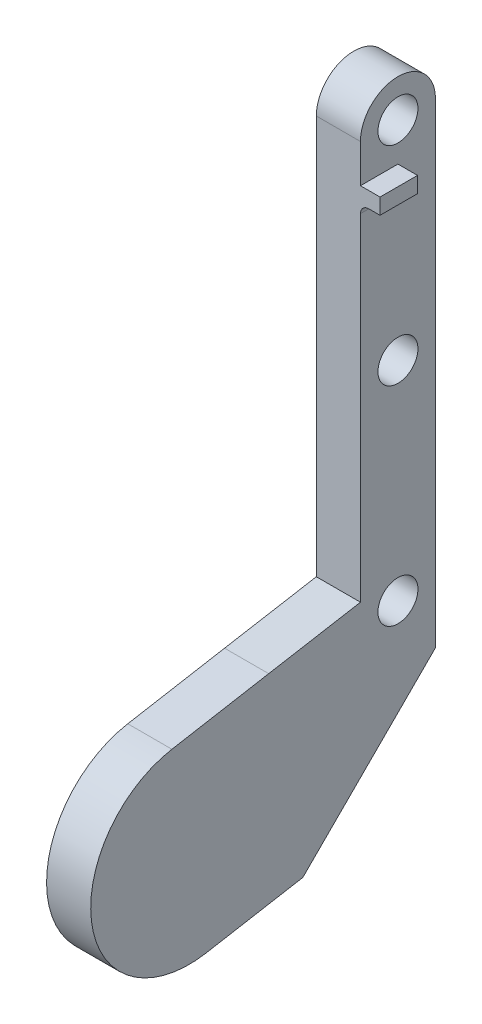
ISO-10303-21;
HEADER;
FILE_DESCRIPTION(('STEP AP214'),'2;1');
FILE_NAME('part.step','',(''),(''),'','','');
FILE_SCHEMA(('AUTOMOTIVE_DESIGN { 1 0 10303 214 1 1 1 1 }'));
ENDSEC;
DATA;
#1=APPLICATION_CONTEXT('core data for automotive mechanical design processes');
#2=APPLICATION_PROTOCOL_DEFINITION('international standard','automotive_design',2000,#1);
#3=PRODUCT_CONTEXT('',#1,'mechanical');
#4=PRODUCT('Part','Part','',(#3));
#5=PRODUCT_RELATED_PRODUCT_CATEGORY('part','',(#4));
#6=PRODUCT_DEFINITION_FORMATION('','',#4);
#7=PRODUCT_DEFINITION_CONTEXT('part definition',#1,'design');
#8=PRODUCT_DEFINITION('design','',#6,#7);
#9=PRODUCT_DEFINITION_SHAPE('','',#8);
#10=(LENGTH_UNIT() NAMED_UNIT(*) SI_UNIT(.MILLI.,.METRE.));
#11=(NAMED_UNIT(*) PLANE_ANGLE_UNIT() SI_UNIT($,.RADIAN.));
#12=(NAMED_UNIT(*) SI_UNIT($,.STERADIAN.) SOLID_ANGLE_UNIT());
#13=UNCERTAINTY_MEASURE_WITH_UNIT(LENGTH_MEASURE(1.E-05),#10,'distance_accuracy_value','');
#14=(GEOMETRIC_REPRESENTATION_CONTEXT(3) GLOBAL_UNCERTAINTY_ASSIGNED_CONTEXT((#13)) GLOBAL_UNIT_ASSIGNED_CONTEXT((#10,
#11,#12)) REPRESENTATION_CONTEXT('',''));
#15=CARTESIAN_POINT('',(0.,0.,0.));
#16=DIRECTION('',(0.,0.,1.));
#17=DIRECTION('',(1.,0.,0.));
#18=AXIS2_PLACEMENT_3D('',#15,#16,#17);
#19=CARTESIAN_POINT('',(2.65,0.,0.));
#20=DIRECTION('',(1.,0.,0.));
#21=DIRECTION('',(0.,0.,-1.));
#22=AXIS2_PLACEMENT_3D('',#19,#20,#21);
#23=PLANE('',#22);
#24=CARTESIAN_POINT('',(2.65,13.5,-25.0900000000005));
#25=DIRECTION('',(1.,0.,0.));
#26=DIRECTION('',(0.,0.,-1.));
#27=AXIS2_PLACEMENT_3D('',#24,#25,#26);
#28=CIRCLE('',#27,2.4);
#29=CARTESIAN_POINT('',(2.65,13.5,-27.4900000000005));
#30=VERTEX_POINT('',#29);
#31=EDGE_CURVE('E170',#30,#30,#28,.T.);
#32=ORIENTED_EDGE('',*,*,#31,.F.);
#33=EDGE_LOOP('',(#32));
#34=FACE_BOUND('',#33,.T.);
#35=CARTESIAN_POINT('',(2.65,38.5,-25.0900000000003));
#36=DIRECTION('',(1.,0.,0.));
#37=DIRECTION('',(0.,0.,-1.));
#38=AXIS2_PLACEMENT_3D('',#35,#36,#37);
#39=CIRCLE('',#38,2.4);
#40=CARTESIAN_POINT('',(2.65,38.5,-27.4900000000003));
#41=VERTEX_POINT('',#40);
#42=EDGE_CURVE('E173',#41,#41,#39,.T.);
#43=ORIENTED_EDGE('',*,*,#42,.F.);
#44=EDGE_LOOP('',(#43));
#45=FACE_BOUND('',#44,.T.);
#46=CARTESIAN_POINT('',(2.65,63.5,-25.09));
#47=DIRECTION('',(1.,0.,0.));
#48=DIRECTION('',(0.,0.,-1.));
#49=AXIS2_PLACEMENT_3D('',#46,#47,#48);
#50=CIRCLE('',#49,2.4);
#51=CARTESIAN_POINT('',(2.65,63.5,-27.49));
#52=VERTEX_POINT('',#51);
#53=EDGE_CURVE('E180',#52,#52,#50,.T.);
#54=ORIENTED_EDGE('',*,*,#53,.F.);
#55=EDGE_LOOP('',(#54));
#56=FACE_BOUND('',#55,.T.);
#57=DIRECTION('',(0.,1.,0.));
#58=VECTOR('',#57,1.);
#59=CARTESIAN_POINT('',(2.65,0.,-25.09));
#60=LINE('',#59,#58);
#61=CARTESIAN_POINT('',(2.65,56.,-25.09));
#62=VERTEX_POINT('',#61);
#63=CARTESIAN_POINT('',(2.65,58.9,-25.09));
#64=VERTEX_POINT('',#63);
#65=EDGE_CURVE('E148',#62,#64,#60,.T.);
#66=ORIENTED_EDGE('',*,*,#65,.F.);
#67=DIRECTION('',(0.,0.,1.));
#68=VECTOR('',#67,1.);
#69=CARTESIAN_POINT('',(2.65,56.,0.));
#70=LINE('',#69,#68);
#71=CARTESIAN_POINT('',(2.65,56.,-20.59));
#72=VERTEX_POINT('',#71);
#73=EDGE_CURVE('E151',#62,#72,#70,.T.);
#74=ORIENTED_EDGE('',*,*,#73,.T.);
#75=DIRECTION('',(0.,-1.,0.));
#76=VECTOR('',#75,1.);
#77=CARTESIAN_POINT('',(2.65,0.,-20.59));
#78=LINE('',#77,#76);
#79=CARTESIAN_POINT('',(2.65,15.5902971195293,-20.59));
#80=VERTEX_POINT('',#79);
#81=EDGE_CURVE('E249',#72,#80,#78,.T.);
#82=ORIENTED_EDGE('',*,*,#81,.T.);
#83=DIRECTION('',(0.,-0.171713304828408,0.985146964135254));
#84=VECTOR('',#83,1.);
#85=CARTESIAN_POINT('',(2.65,11.6475471569255,2.03019335010184));
#86=LINE('',#85,#84);
#87=CARTESIAN_POINT('',(2.65,13.6697799820138,-9.57168298907428));
#88=VERTEX_POINT('',#87);
#89=EDGE_CURVE('E245',#80,#88,#86,.T.);
#90=ORIENTED_EDGE('',*,*,#89,.T.);
#91=DIRECTION('',(0.,-0.173648177666931,0.984807753012208));
#92=VECTOR('',#91,1.);
#93=CARTESIAN_POINT('',(2.65,11.6207314855441,2.04904849646979));
#94=LINE('',#93,#92);
#95=CARTESIAN_POINT('',(2.65,11.6207314855441,2.04904849646979));
#96=VERTEX_POINT('',#95);
#97=EDGE_CURVE('E174',#88,#96,#94,.T.);
#98=ORIENTED_EDGE('',*,*,#97,.T.);
#99=CARTESIAN_POINT('',(2.65,0.,0.));
#100=DIRECTION('',(1.,0.,0.));
#101=DIRECTION('',(0.,0.,-1.));
#102=AXIS2_PLACEMENT_3D('',#99,#100,#101);
#103=CIRCLE('',#102,11.8);
#104=CARTESIAN_POINT('',(2.65,-11.6207314855441,-2.04904849646979));
#105=VERTEX_POINT('',#104);
#106=EDGE_CURVE('E187',#105,#96,#103,.F.);
#107=ORIENTED_EDGE('',*,*,#106,.F.);
#108=DIRECTION('',(0.,0.173648177666932,-0.984807753012208));
#109=VECTOR('',#108,1.);
#110=CARTESIAN_POINT('',(2.65,-11.6207314855441,-2.04904849646979));
#111=LINE('',#110,#109);
#112=CARTESIAN_POINT('',(2.65,-9.57168298907426,-13.6697799820139));
#113=VERTEX_POINT('',#112);
#114=EDGE_CURVE('E259',#105,#113,#111,.T.);
#115=ORIENTED_EDGE('',*,*,#114,.T.);
#116=DIRECTION('',(0.,-0.70710678118655,0.707106781186545));
#117=VECTOR('',#116,1.);
#118=CARTESIAN_POINT('',(2.65,-11.620731485544,-11.6207314855441));
#119=LINE('',#118,#117);
#120=CARTESIAN_POINT('',(2.65,6.34853702891123,-29.5899999999993));
#121=VERTEX_POINT('',#120);
#122=EDGE_CURVE('E256',#121,#113,#119,.T.);
#123=ORIENTED_EDGE('',*,*,#122,.F.);
#124=DIRECTION('',(0.,-1.,0.));
#125=VECTOR('',#124,1.);
#126=CARTESIAN_POINT('',(2.65,-3.91592493590791E-13,-29.5899999999992));
#127=LINE('',#126,#125);
#128=CARTESIAN_POINT('',(2.65,63.5,-29.59));
#129=VERTEX_POINT('',#128);
#130=EDGE_CURVE('E253',#129,#121,#127,.T.);
#131=ORIENTED_EDGE('',*,*,#130,.F.);
#132=CARTESIAN_POINT('',(2.65,63.5,-25.09));
#133=DIRECTION('',(1.,0.,0.));
#134=DIRECTION('',(0.,0.,-1.));
#135=AXIS2_PLACEMENT_3D('',#132,#133,#134);
#136=CIRCLE('',#135,4.5);
#137=CARTESIAN_POINT('',(2.65,63.5,-20.59));
#138=VERTEX_POINT('',#137);
#139=EDGE_CURVE('E250',#138,#129,#136,.F.);
#140=ORIENTED_EDGE('',*,*,#139,.F.);
#141=CARTESIAN_POINT('',(2.65,58.9,-20.59));
#142=VERTEX_POINT('',#141);
#143=EDGE_CURVE('E108',#138,#142,#78,.T.);
#144=ORIENTED_EDGE('',*,*,#143,.T.);
#145=DIRECTION('',(0.,0.,1.));
#146=VECTOR('',#145,1.);
#147=CARTESIAN_POINT('',(2.65,58.9,0.));
#148=LINE('',#147,#146);
#149=EDGE_CURVE('E74',#64,#142,#148,.T.);
#150=ORIENTED_EDGE('',*,*,#149,.F.);
#151=EDGE_LOOP('',(#66,#74,#82,#90,#98,#107,#115,#123,#131,#140,#144,#150));
#152=FACE_BOUND('',#151,.T.);
#153=ADVANCED_FACE('F70',(#34,#45,#56,#152),#23,.T.);
#154=CARTESIAN_POINT('',(2.65,63.5,-25.09));
#155=DIRECTION('',(-1.,0.,0.));
#156=DIRECTION('',(0.,0.,1.));
#157=AXIS2_PLACEMENT_3D('',#154,#155,#156);
#158=CYLINDRICAL_SURFACE('',#157,2.4);
#159=ORIENTED_EDGE('',*,*,#53,.T.);
#160=EDGE_LOOP('',(#159));
#161=FACE_BOUND('',#160,.T.);
#162=CARTESIAN_POINT('',(-2.65,63.5,-25.09));
#163=DIRECTION('',(1.,0.,0.));
#164=DIRECTION('',(0.,0.,-1.));
#165=AXIS2_PLACEMENT_3D('',#162,#163,#164);
#166=CIRCLE('',#165,2.4);
#167=CARTESIAN_POINT('',(-2.65,63.5,-27.49));
#168=VERTEX_POINT('',#167);
#169=EDGE_CURVE('E184',#168,#168,#166,.T.);
#170=ORIENTED_EDGE('',*,*,#169,.F.);
#171=EDGE_LOOP('',(#170));
#172=FACE_BOUND('',#171,.T.);
#173=ADVANCED_FACE('F334',(#161,#172),#158,.F.);
#174=CARTESIAN_POINT('',(2.65,38.5,-25.0900000000003));
#175=DIRECTION('',(-1.,0.,0.));
#176=DIRECTION('',(0.,0.,1.));
#177=AXIS2_PLACEMENT_3D('',#174,#175,#176);
#178=CYLINDRICAL_SURFACE('',#177,2.4);
#179=ORIENTED_EDGE('',*,*,#42,.T.);
#180=EDGE_LOOP('',(#179));
#181=FACE_BOUND('',#180,.T.);
#182=CARTESIAN_POINT('',(-2.65,38.5,-25.0900000000003));
#183=DIRECTION('',(1.,0.,0.));
#184=DIRECTION('',(0.,0.,-1.));
#185=AXIS2_PLACEMENT_3D('',#182,#183,#184);
#186=CIRCLE('',#185,2.4);
#187=CARTESIAN_POINT('',(-2.65,38.5,-27.4900000000003));
#188=VERTEX_POINT('',#187);
#189=EDGE_CURVE('E178',#188,#188,#186,.T.);
#190=ORIENTED_EDGE('',*,*,#189,.F.);
#191=EDGE_LOOP('',(#190));
#192=FACE_BOUND('',#191,.T.);
#193=ADVANCED_FACE('F341',(#181,#192),#178,.F.);
#194=CARTESIAN_POINT('',(2.65,13.5,-25.0900000000005));
#195=DIRECTION('',(-1.,0.,0.));
#196=DIRECTION('',(0.,0.,1.));
#197=AXIS2_PLACEMENT_3D('',#194,#195,#196);
#198=CYLINDRICAL_SURFACE('',#197,2.4);
#199=ORIENTED_EDGE('',*,*,#31,.T.);
#200=EDGE_LOOP('',(#199));
#201=FACE_BOUND('',#200,.T.);
#202=CARTESIAN_POINT('',(-2.65,13.5,-25.0900000000005));
#203=DIRECTION('',(1.,0.,0.));
#204=DIRECTION('',(0.,0.,-1.));
#205=AXIS2_PLACEMENT_3D('',#202,#203,#204);
#206=CIRCLE('',#205,2.4);
#207=CARTESIAN_POINT('',(-2.65,13.5,-27.4900000000005));
#208=VERTEX_POINT('',#207);
#209=EDGE_CURVE('E175',#208,#208,#206,.T.);
#210=ORIENTED_EDGE('',*,*,#209,.F.);
#211=EDGE_LOOP('',(#210));
#212=FACE_BOUND('',#211,.T.);
#213=ADVANCED_FACE('F361',(#201,#212),#198,.F.);
#214=CARTESIAN_POINT('',(2.65,-11.6207314855441,-2.04904849646979));
#215=DIRECTION('',(0.,0.984807753012208,0.173648177666932));
#216=DIRECTION('',(0.,-0.173648177666932,0.984807753012208));
#217=AXIS2_PLACEMENT_3D('',#214,#215,#216);
#218=PLANE('',#217);
#219=DIRECTION('',(0.,0.173648177666932,-0.984807753012208));
#220=VECTOR('',#219,1.);
#221=CARTESIAN_POINT('',(-2.65,-11.6207314855441,-2.04904849646979));
#222=LINE('',#221,#220);
#223=CARTESIAN_POINT('',(-2.65,-11.6207314855441,-2.04904849646979));
#224=VERTEX_POINT('',#223);
#225=CARTESIAN_POINT('',(-2.65,-9.57168298907426,-13.6697799820139));
#226=VERTEX_POINT('',#225);
#227=EDGE_CURVE('E237',#224,#226,#222,.T.);
#228=ORIENTED_EDGE('',*,*,#227,.T.);
#229=DIRECTION('',(-1.,0.,0.));
#230=VECTOR('',#229,1.);
#231=CARTESIAN_POINT('',(2.65,-9.57168298907426,-13.6697799820139));
#232=LINE('',#231,#230);
#233=EDGE_CURVE('E206',#113,#226,#232,.T.);
#234=ORIENTED_EDGE('',*,*,#233,.F.);
#235=ORIENTED_EDGE('',*,*,#114,.F.);
#236=DIRECTION('',(-1.,0.,0.));
#237=VECTOR('',#236,1.);
#238=CARTESIAN_POINT('',(2.65,-11.6207314855441,-2.04904849646979));
#239=LINE('',#238,#237);
#240=EDGE_CURVE('E117',#105,#224,#239,.T.);
#241=ORIENTED_EDGE('',*,*,#240,.T.);
#242=EDGE_LOOP('',(#228,#234,#235,#241));
#243=FACE_BOUND('',#242,.T.);
#244=ADVANCED_FACE('F305',(#243),#218,.F.);
#245=CARTESIAN_POINT('',(2.65,-11.620731485544,-11.6207314855441));
#246=DIRECTION('',(0.,-0.707106781186545,-0.70710678118655));
#247=DIRECTION('',(0.,0.70710678118655,-0.707106781186545));
#248=AXIS2_PLACEMENT_3D('',#245,#246,#247);
#249=PLANE('',#248);
#250=DIRECTION('',(0.,-0.70710678118655,0.707106781186545));
#251=VECTOR('',#250,1.);
#252=CARTESIAN_POINT('',(-2.65,-11.620731485544,-11.6207314855441));
#253=LINE('',#252,#251);
#254=CARTESIAN_POINT('',(-2.65,6.34853702891123,-29.5899999999993));
#255=VERTEX_POINT('',#254);
#256=EDGE_CURVE('E234',#255,#226,#253,.T.);
#257=ORIENTED_EDGE('',*,*,#256,.F.);
#258=DIRECTION('',(-1.,0.,0.));
#259=VECTOR('',#258,1.);
#260=CARTESIAN_POINT('',(2.65,6.34853702891123,-29.5899999999993));
#261=LINE('',#260,#259);
#262=EDGE_CURVE('E207',#121,#255,#261,.T.);
#263=ORIENTED_EDGE('',*,*,#262,.F.);
#264=ORIENTED_EDGE('',*,*,#122,.T.);
#265=ORIENTED_EDGE('',*,*,#233,.T.);
#266=EDGE_LOOP('',(#257,#263,#264,#265));
#267=FACE_BOUND('',#266,.T.);
#268=ADVANCED_FACE('F394',(#267),#249,.T.);
#269=CARTESIAN_POINT('',(2.65,-3.91592493590791E-13,-29.5899999999992));
#270=DIRECTION('',(0.,0.,-1.));
#271=DIRECTION('',(0.,1.,0.));
#272=AXIS2_PLACEMENT_3D('',#269,#270,#271);
#273=PLANE('',#272);
#274=DIRECTION('',(0.,-1.,0.));
#275=VECTOR('',#274,1.);
#276=CARTESIAN_POINT('',(-2.65,-3.91592493590791E-13,-29.5899999999992));
#277=LINE('',#276,#275);
#278=CARTESIAN_POINT('',(-2.65,63.5,-29.59));
#279=VERTEX_POINT('',#278);
#280=EDGE_CURVE('E231',#279,#255,#277,.T.);
#281=ORIENTED_EDGE('',*,*,#280,.F.);
#282=DIRECTION('',(-1.,0.,0.));
#283=VECTOR('',#282,1.);
#284=CARTESIAN_POINT('',(2.65,63.5,-29.59));
#285=LINE('',#284,#283);
#286=EDGE_CURVE('E211',#129,#279,#285,.T.);
#287=ORIENTED_EDGE('',*,*,#286,.F.);
#288=ORIENTED_EDGE('',*,*,#130,.T.);
#289=ORIENTED_EDGE('',*,*,#262,.T.);
#290=EDGE_LOOP('',(#281,#287,#288,#289));
#291=FACE_BOUND('',#290,.T.);
#292=ADVANCED_FACE('F311',(#291),#273,.T.);
#293=CARTESIAN_POINT('',(2.65,63.5,-25.09));
#294=DIRECTION('',(-1.,0.,0.));
#295=DIRECTION('',(0.,0.,1.));
#296=AXIS2_PLACEMENT_3D('',#293,#294,#295);
#297=CYLINDRICAL_SURFACE('',#296,4.5);
#298=CARTESIAN_POINT('',(-2.65,63.5,-25.09));
#299=DIRECTION('',(1.,0.,0.));
#300=DIRECTION('',(0.,0.,-1.));
#301=AXIS2_PLACEMENT_3D('',#298,#299,#300);
#302=CIRCLE('',#301,4.5);
#303=CARTESIAN_POINT('',(-2.65,63.5,-20.59));
#304=VERTEX_POINT('',#303);
#305=EDGE_CURVE('E228',#304,#279,#302,.F.);
#306=ORIENTED_EDGE('',*,*,#305,.F.);
#307=DIRECTION('',(-1.,0.,0.));
#308=VECTOR('',#307,1.);
#309=CARTESIAN_POINT('',(2.65,63.5,-20.59));
#310=LINE('',#309,#308);
#311=EDGE_CURVE('E213',#138,#304,#310,.T.);
#312=ORIENTED_EDGE('',*,*,#311,.F.);
#313=ORIENTED_EDGE('',*,*,#139,.T.);
#314=ORIENTED_EDGE('',*,*,#286,.T.);
#315=EDGE_LOOP('',(#306,#312,#313,#314));
#316=FACE_BOUND('',#315,.T.);
#317=ADVANCED_FACE('F315',(#316),#297,.T.);
#318=CARTESIAN_POINT('',(2.65,0.,-20.59));
#319=DIRECTION('',(0.,0.,-1.));
#320=DIRECTION('',(-1.,0.,0.));
#321=AXIS2_PLACEMENT_3D('',#318,#319,#320);
#322=PLANE('',#321);
#323=ORIENTED_EDGE('',*,*,#81,.F.);
#324=CARTESIAN_POINT('',(3.65,56.,-20.59));
#325=DIRECTION('',(0.,0.,-1.));
#326=DIRECTION('',(-1.,0.,0.));
#327=AXIS2_PLACEMENT_3D('',#324,#325,#326);
#328=CIRCLE('',#327,1.);
#329=CARTESIAN_POINT('',(3.65,57.,-20.59));
#330=VERTEX_POINT('',#329);
#331=EDGE_CURVE('E80',#72,#330,#328,.T.);
#332=ORIENTED_EDGE('',*,*,#331,.T.);
#333=DIRECTION('',(-1.,0.,0.));
#334=VECTOR('',#333,1.);
#335=CARTESIAN_POINT('',(5.,57.,-20.59));
#336=LINE('',#335,#334);
#337=CARTESIAN_POINT('',(5.,57.,-20.59));
#338=VERTEX_POINT('',#337);
#339=EDGE_CURVE('E242',#338,#330,#336,.T.);
#340=ORIENTED_EDGE('',*,*,#339,.F.);
#341=DIRECTION('',(0.,-1.,0.));
#342=VECTOR('',#341,1.);
#343=CARTESIAN_POINT('',(5.,59.,-20.59));
#344=LINE('',#343,#342);
#345=CARTESIAN_POINT('',(5.,58.9,-20.59));
#346=VERTEX_POINT('',#345);
#347=EDGE_CURVE('E203',#346,#338,#344,.T.);
#348=ORIENTED_EDGE('',*,*,#347,.F.);
#349=DIRECTION('',(-1.,0.,0.));
#350=VECTOR('',#349,1.);
#351=CARTESIAN_POINT('',(5.,58.9,-20.59));
#352=LINE('',#351,#350);
#353=EDGE_CURVE('E194',#346,#142,#352,.T.);
#354=ORIENTED_EDGE('',*,*,#353,.T.);
#355=ORIENTED_EDGE('',*,*,#143,.F.);
#356=ORIENTED_EDGE('',*,*,#311,.T.);
#357=DIRECTION('',(0.,-1.,0.));
#358=VECTOR('',#357,1.);
#359=CARTESIAN_POINT('',(-2.65,0.,-20.59));
#360=LINE('',#359,#358);
#361=CARTESIAN_POINT('',(-2.65,15.5902971195293,-20.59));
#362=VERTEX_POINT('',#361);
#363=EDGE_CURVE('E226',#304,#362,#360,.T.);
#364=ORIENTED_EDGE('',*,*,#363,.T.);
#365=DIRECTION('',(-1.,0.,0.));
#366=VECTOR('',#365,1.);
#367=CARTESIAN_POINT('',(2.65,15.5902971195293,-20.59));
#368=LINE('',#367,#366);
#369=EDGE_CURVE('E215',#80,#362,#368,.T.);
#370=ORIENTED_EDGE('',*,*,#369,.F.);
#371=EDGE_LOOP('',(#323,#332,#340,#348,#354,#355,#356,#364,#370));
#372=FACE_BOUND('',#371,.T.);
#373=ADVANCED_FACE('F200',(#372),#322,.F.);
#374=CARTESIAN_POINT('',(2.65,11.6475471569255,2.03019335010184));
#375=DIRECTION('',(0.,-0.985146964135253,-0.171713304828408));
#376=DIRECTION('',(0.,0.171713304828408,-0.985146964135253));
#377=AXIS2_PLACEMENT_3D('',#374,#375,#376);
#378=PLANE('',#377);
#379=DIRECTION('',(0.,-0.171713304828408,0.985146964135254));
#380=VECTOR('',#379,1.);
#381=CARTESIAN_POINT('',(-2.65,11.6475471569255,2.03019335010184));
#382=LINE('',#381,#380);
#383=CARTESIAN_POINT('',(-2.65,13.6697799820138,-9.57168298907428));
#384=VERTEX_POINT('',#383);
#385=EDGE_CURVE('E224',#362,#384,#382,.T.);
#386=ORIENTED_EDGE('',*,*,#385,.T.);
#387=DIRECTION('',(-1.,0.,0.));
#388=VECTOR('',#387,1.);
#389=CARTESIAN_POINT('',(2.65,13.6697799820138,-9.57168298907428));
#390=LINE('',#389,#388);
#391=EDGE_CURVE('E218',#88,#384,#390,.T.);
#392=ORIENTED_EDGE('',*,*,#391,.F.);
#393=ORIENTED_EDGE('',*,*,#89,.F.);
#394=ORIENTED_EDGE('',*,*,#369,.T.);
#395=EDGE_LOOP('',(#386,#392,#393,#394));
#396=FACE_BOUND('',#395,.T.);
#397=ADVANCED_FACE('F323',(#396),#378,.F.);
#398=CARTESIAN_POINT('',(2.65,11.6207314855441,2.04904849646979));
#399=DIRECTION('',(0.,-0.984807753012208,-0.173648177666931));
#400=DIRECTION('',(0.,0.173648177666931,-0.984807753012208));
#401=AXIS2_PLACEMENT_3D('',#398,#399,#400);
#402=PLANE('',#401);
#403=DIRECTION('',(0.,-0.173648177666931,0.984807753012208));
#404=VECTOR('',#403,1.);
#405=CARTESIAN_POINT('',(-2.65,11.6207314855441,2.04904849646979));
#406=LINE('',#405,#404);
#407=CARTESIAN_POINT('',(-2.65,11.6207314855441,2.04904849646979));
#408=VERTEX_POINT('',#407);
#409=EDGE_CURVE('E179',#384,#408,#406,.T.);
#410=ORIENTED_EDGE('',*,*,#409,.T.);
#411=DIRECTION('',(-1.,0.,0.));
#412=VECTOR('',#411,1.);
#413=CARTESIAN_POINT('',(2.65,11.6207314855441,2.04904849646979));
#414=LINE('',#413,#412);
#415=EDGE_CURVE('E183',#96,#408,#414,.T.);
#416=ORIENTED_EDGE('',*,*,#415,.F.);
#417=ORIENTED_EDGE('',*,*,#97,.F.);
#418=ORIENTED_EDGE('',*,*,#391,.T.);
#419=EDGE_LOOP('',(#410,#416,#417,#418));
#420=FACE_BOUND('',#419,.T.);
#421=ADVANCED_FACE('F299',(#420),#402,.F.);
#422=CARTESIAN_POINT('',(2.65,0.,0.));
#423=DIRECTION('',(-1.,0.,0.));
#424=DIRECTION('',(0.,0.,1.));
#425=AXIS2_PLACEMENT_3D('',#422,#423,#424);
#426=CYLINDRICAL_SURFACE('',#425,11.8);
#427=CARTESIAN_POINT('',(-2.65,0.,0.));
#428=DIRECTION('',(1.,0.,0.));
#429=DIRECTION('',(0.,0.,-1.));
#430=AXIS2_PLACEMENT_3D('',#427,#428,#429);
#431=CIRCLE('',#430,11.8);
#432=EDGE_CURVE('E239',#224,#408,#431,.F.);
#433=ORIENTED_EDGE('',*,*,#432,.F.);
#434=ORIENTED_EDGE('',*,*,#240,.F.);
#435=ORIENTED_EDGE('',*,*,#106,.T.);
#436=ORIENTED_EDGE('',*,*,#415,.T.);
#437=EDGE_LOOP('',(#433,#434,#435,#436));
#438=FACE_BOUND('',#437,.T.);
#439=ADVANCED_FACE('F303',(#438),#426,.T.);
#440=CARTESIAN_POINT('',(-2.65,0.,0.));
#441=DIRECTION('',(1.,0.,0.));
#442=DIRECTION('',(0.,0.,-1.));
#443=AXIS2_PLACEMENT_3D('',#440,#441,#442);
#444=PLANE('',#443);
#445=ORIENTED_EDGE('',*,*,#432,.T.);
#446=ORIENTED_EDGE('',*,*,#409,.F.);
#447=ORIENTED_EDGE('',*,*,#385,.F.);
#448=ORIENTED_EDGE('',*,*,#363,.F.);
#449=ORIENTED_EDGE('',*,*,#305,.T.);
#450=ORIENTED_EDGE('',*,*,#280,.T.);
#451=ORIENTED_EDGE('',*,*,#256,.T.);
#452=ORIENTED_EDGE('',*,*,#227,.F.);
#453=EDGE_LOOP('',(#445,#446,#447,#448,#449,#450,#451,#452));
#454=FACE_BOUND('',#453,.T.);
#455=ORIENTED_EDGE('',*,*,#209,.T.);
#456=EDGE_LOOP('',(#455));
#457=FACE_BOUND('',#456,.T.);
#458=ORIENTED_EDGE('',*,*,#189,.T.);
#459=EDGE_LOOP('',(#458));
#460=FACE_BOUND('',#459,.T.);
#461=ORIENTED_EDGE('',*,*,#169,.T.);
#462=EDGE_LOOP('',(#461));
#463=FACE_BOUND('',#462,.T.);
#464=ADVANCED_FACE('F320',(#454,#457,#460,#463),#444,.F.);
#465=CARTESIAN_POINT('',(5.,57.,-20.59));
#466=DIRECTION('',(0.,1.,0.));
#467=DIRECTION('',(0.,0.,1.));
#468=AXIS2_PLACEMENT_3D('',#465,#466,#467);
#469=PLANE('',#468);
#470=ORIENTED_EDGE('',*,*,#339,.T.);
#471=DIRECTION('',(0.,0.,1.));
#472=VECTOR('',#471,1.);
#473=CARTESIAN_POINT('',(3.65,57.,-20.59));
#474=LINE('',#473,#472);
#475=CARTESIAN_POINT('',(3.65,57.,-25.09));
#476=VERTEX_POINT('',#475);
#477=EDGE_CURVE('E164',#330,#476,#474,.F.);
#478=ORIENTED_EDGE('',*,*,#477,.T.);
#479=DIRECTION('',(-1.,0.,0.));
#480=VECTOR('',#479,1.);
#481=CARTESIAN_POINT('',(5.,57.,-25.09));
#482=LINE('',#481,#480);
#483=CARTESIAN_POINT('',(5.,57.,-25.09));
#484=VERTEX_POINT('',#483);
#485=EDGE_CURVE('E160',#484,#476,#482,.T.);
#486=ORIENTED_EDGE('',*,*,#485,.F.);
#487=DIRECTION('',(0.,0.,-1.));
#488=VECTOR('',#487,1.);
#489=CARTESIAN_POINT('',(5.,57.,-20.59));
#490=LINE('',#489,#488);
#491=EDGE_CURVE('E267',#338,#484,#490,.T.);
#492=ORIENTED_EDGE('',*,*,#491,.F.);
#493=EDGE_LOOP('',(#470,#478,#486,#492));
#494=FACE_BOUND('',#493,.T.);
#495=ADVANCED_FACE('F277',(#494),#469,.F.);
#496=CARTESIAN_POINT('',(5.,59.,-25.09));
#497=DIRECTION('',(0.,0.,-1.));
#498=DIRECTION('',(-1.,0.,0.));
#499=AXIS2_PLACEMENT_3D('',#496,#497,#498);
#500=PLANE('',#499);
#501=ORIENTED_EDGE('',*,*,#485,.T.);
#502=CARTESIAN_POINT('',(3.65,56.,-25.09));
#503=DIRECTION('',(0.,0.,-1.));
#504=DIRECTION('',(-1.,0.,0.));
#505=AXIS2_PLACEMENT_3D('',#502,#503,#504);
#506=CIRCLE('',#505,1.);
#507=EDGE_CURVE('E13',#476,#62,#506,.F.);
#508=ORIENTED_EDGE('',*,*,#507,.T.);
#509=ORIENTED_EDGE('',*,*,#65,.T.);
#510=DIRECTION('',(-1.,0.,0.));
#511=VECTOR('',#510,1.);
#512=CARTESIAN_POINT('',(5.,58.9,-25.09));
#513=LINE('',#512,#511);
#514=CARTESIAN_POINT('',(5.,58.9,-25.09));
#515=VERTEX_POINT('',#514);
#516=EDGE_CURVE('E192',#515,#64,#513,.T.);
#517=ORIENTED_EDGE('',*,*,#516,.F.);
#518=DIRECTION('',(0.,-1.,0.));
#519=VECTOR('',#518,1.);
#520=CARTESIAN_POINT('',(5.,59.,-25.09));
#521=LINE('',#520,#519);
#522=EDGE_CURVE('E197',#515,#484,#521,.T.);
#523=ORIENTED_EDGE('',*,*,#522,.T.);
#524=EDGE_LOOP('',(#501,#508,#509,#517,#523));
#525=FACE_BOUND('',#524,.T.);
#526=ADVANCED_FACE('F157',(#525),#500,.T.);
#527=CARTESIAN_POINT('',(5.,58.9,-20.59));
#528=DIRECTION('',(0.,1.,0.));
#529=DIRECTION('',(0.,0.,1.));
#530=AXIS2_PLACEMENT_3D('',#527,#528,#529);
#531=PLANE('',#530);
#532=ORIENTED_EDGE('',*,*,#516,.T.);
#533=ORIENTED_EDGE('',*,*,#149,.T.);
#534=ORIENTED_EDGE('',*,*,#353,.F.);
#535=DIRECTION('',(0.,0.,-1.));
#536=VECTOR('',#535,1.);
#537=CARTESIAN_POINT('',(5.,58.9,-20.59));
#538=LINE('',#537,#536);
#539=EDGE_CURVE('E195',#346,#515,#538,.T.);
#540=ORIENTED_EDGE('',*,*,#539,.T.);
#541=EDGE_LOOP('',(#532,#533,#534,#540));
#542=FACE_BOUND('',#541,.T.);
#543=ADVANCED_FACE('F72',(#542),#531,.T.);
#544=CARTESIAN_POINT('',(5.,0.,0.));
#545=DIRECTION('',(1.,0.,0.));
#546=DIRECTION('',(0.,0.,-1.));
#547=AXIS2_PLACEMENT_3D('',#544,#545,#546);
#548=PLANE('',#547);
#549=ORIENTED_EDGE('',*,*,#347,.T.);
#550=ORIENTED_EDGE('',*,*,#491,.T.);
#551=ORIENTED_EDGE('',*,*,#522,.F.);
#552=ORIENTED_EDGE('',*,*,#539,.F.);
#553=EDGE_LOOP('',(#549,#550,#551,#552));
#554=FACE_BOUND('',#553,.T.);
#555=ADVANCED_FACE('F272',(#554),#548,.T.);
#556=CARTESIAN_POINT('',(3.65,56.,0.));
#557=DIRECTION('',(0.,0.,1.));
#558=DIRECTION('',(1.,0.,0.));
#559=AXIS2_PLACEMENT_3D('',#556,#557,#558);
#560=CYLINDRICAL_SURFACE('',#559,1.);
#561=ORIENTED_EDGE('',*,*,#507,.F.);
#562=ORIENTED_EDGE('',*,*,#477,.F.);
#563=ORIENTED_EDGE('',*,*,#331,.F.);
#564=ORIENTED_EDGE('',*,*,#73,.F.);
#565=EDGE_LOOP('',(#561,#562,#563,#564));
#566=FACE_BOUND('',#565,.T.);
#567=ADVANCED_FACE('F163',(#566),#560,.F.);
#568=CLOSED_SHELL('',(#153,#173,#193,#213,#244,#268,#292,#317,#373,#397,#421,#439,#464,#495,
#526,#543,#555,#567));
#569=MANIFOLD_SOLID_BREP('B2',#568);
#570=ADVANCED_BREP_SHAPE_REPRESENTATION('',(#18,#569),#14);
#571=SHAPE_DEFINITION_REPRESENTATION(#9,#570);
ENDSEC;
END-ISO-10303-21;
